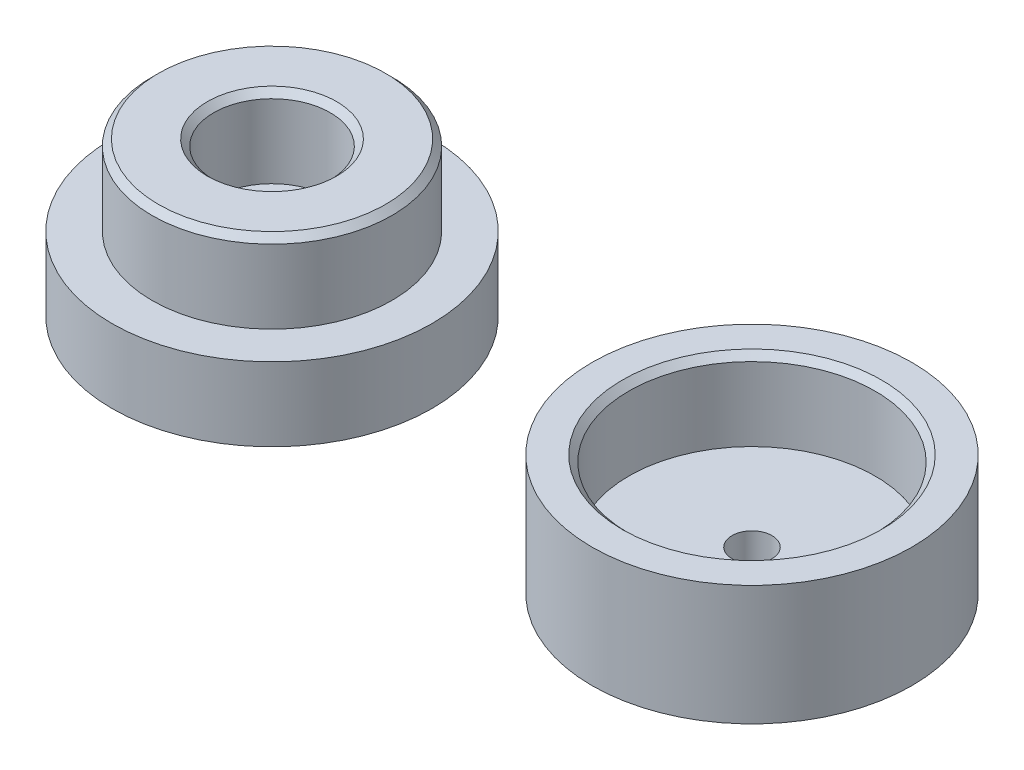
ISO-10303-21;
HEADER;
FILE_DESCRIPTION(('STEP AP214'),'2;1');
FILE_NAME('part.step','',(''),(''),'','','');
FILE_SCHEMA(('AUTOMOTIVE_DESIGN { 1 0 10303 214 1 1 1 1 }'));
ENDSEC;
DATA;
#1=APPLICATION_CONTEXT('core data for automotive mechanical design processes');
#2=APPLICATION_PROTOCOL_DEFINITION('international standard','automotive_design',2000,#1);
#3=PRODUCT_CONTEXT('',#1,'mechanical');
#4=PRODUCT('Part','Part','',(#3));
#5=PRODUCT_RELATED_PRODUCT_CATEGORY('part','',(#4));
#6=PRODUCT_DEFINITION_FORMATION('','',#4);
#7=PRODUCT_DEFINITION_CONTEXT('part definition',#1,'design');
#8=PRODUCT_DEFINITION('design','',#6,#7);
#9=PRODUCT_DEFINITION_SHAPE('','',#8);
#10=(LENGTH_UNIT() NAMED_UNIT(*) SI_UNIT(.MILLI.,.METRE.));
#11=(NAMED_UNIT(*) PLANE_ANGLE_UNIT() SI_UNIT($,.RADIAN.));
#12=(NAMED_UNIT(*) SI_UNIT($,.STERADIAN.) SOLID_ANGLE_UNIT());
#13=UNCERTAINTY_MEASURE_WITH_UNIT(LENGTH_MEASURE(1.E-05),#10,'distance_accuracy_value','');
#14=(GEOMETRIC_REPRESENTATION_CONTEXT(3) GLOBAL_UNCERTAINTY_ASSIGNED_CONTEXT((#13)) GLOBAL_UNIT_ASSIGNED_CONTEXT((#10,
#11,#12)) REPRESENTATION_CONTEXT('',''));
#15=CARTESIAN_POINT('',(0.,0.,0.));
#16=DIRECTION('',(0.,0.,1.));
#17=DIRECTION('',(1.,0.,0.));
#18=AXIS2_PLACEMENT_3D('',#15,#16,#17);
#19=CARTESIAN_POINT('',(0.,0.,0.));
#20=DIRECTION('',(0.,1.,0.));
#21=DIRECTION('',(0.,0.,1.));
#22=AXIS2_PLACEMENT_3D('',#19,#20,#21);
#23=PLANE('',#22);
#24=CARTESIAN_POINT('',(19.05,0.,0.));
#25=DIRECTION('',(0.,1.,0.));
#26=DIRECTION('',(0.,0.,1.));
#27=AXIS2_PLACEMENT_3D('',#24,#25,#26);
#28=CIRCLE('',#27,1.04774999999999);
#29=CARTESIAN_POINT('',(19.05,0.,1.04774999999999));
#30=VERTEX_POINT('',#29);
#31=EDGE_CURVE('E83',#30,#30,#28,.T.);
#32=ORIENTED_EDGE('',*,*,#31,.T.);
#33=EDGE_LOOP('',(#32));
#34=FACE_BOUND('',#33,.T.);
#35=CARTESIAN_POINT('',(19.05,0.,0.));
#36=DIRECTION('',(0.,1.,0.));
#37=DIRECTION('',(0.,0.,1.));
#38=AXIS2_PLACEMENT_3D('',#35,#36,#37);
#39=CIRCLE('',#38,6.35);
#40=CARTESIAN_POINT('',(19.05,0.,6.35));
#41=VERTEX_POINT('',#40);
#42=EDGE_CURVE('E95',#41,#41,#39,.T.);
#43=ORIENTED_EDGE('',*,*,#42,.F.);
#44=EDGE_LOOP('',(#43));
#45=FACE_BOUND('',#44,.T.);
#46=ADVANCED_FACE('F67',(#34,#45),#23,.F.);
#47=CARTESIAN_POINT('',(19.05,1.5875,0.));
#48=DIRECTION('',(0.,-1.,0.));
#49=DIRECTION('',(0.,0.,-1.));
#50=AXIS2_PLACEMENT_3D('',#47,#48,#49);
#51=CYLINDRICAL_SURFACE('',#50,6.35);
#52=ORIENTED_EDGE('',*,*,#42,.T.);
#53=EDGE_LOOP('',(#52));
#54=FACE_BOUND('',#53,.T.);
#55=CARTESIAN_POINT('',(19.05,4.7625,0.));
#56=DIRECTION('',(0.,1.,0.));
#57=DIRECTION('',(0.,0.,1.));
#58=AXIS2_PLACEMENT_3D('',#55,#56,#57);
#59=CIRCLE('',#58,6.35);
#60=CARTESIAN_POINT('',(19.05,4.7625,6.35));
#61=VERTEX_POINT('',#60);
#62=EDGE_CURVE('E92',#61,#61,#59,.T.);
#63=ORIENTED_EDGE('',*,*,#62,.F.);
#64=EDGE_LOOP('',(#63));
#65=FACE_BOUND('',#64,.T.);
#66=ADVANCED_FACE('F103',(#54,#65),#51,.T.);
#67=CARTESIAN_POINT('',(19.05,4.7625,0.));
#68=DIRECTION('',(0.,1.,0.));
#69=DIRECTION('',(0.,0.,1.));
#70=AXIS2_PLACEMENT_3D('',#67,#68,#69);
#71=PLANE('',#70);
#72=CARTESIAN_POINT('',(19.05,4.7625,0.));
#73=DIRECTION('',(0.,1.,0.));
#74=DIRECTION('',(0.,0.,1.));
#75=AXIS2_PLACEMENT_3D('',#72,#73,#74);
#76=CIRCLE('',#75,5.1435);
#77=CARTESIAN_POINT('',(19.05,4.7625,5.1435));
#78=VERTEX_POINT('',#77);
#79=EDGE_CURVE('E12',#78,#78,#76,.F.);
#80=ORIENTED_EDGE('',*,*,#79,.T.);
#81=EDGE_LOOP('',(#80));
#82=FACE_BOUND('',#81,.T.);
#83=ORIENTED_EDGE('',*,*,#62,.T.);
#84=EDGE_LOOP('',(#83));
#85=FACE_BOUND('',#84,.T.);
#86=ADVANCED_FACE('F101',(#82,#85),#71,.T.);
#87=CARTESIAN_POINT('',(19.05,4.7625,0.));
#88=DIRECTION('',(0.,-1.,0.));
#89=DIRECTION('',(0.,0.,-1.));
#90=AXIS2_PLACEMENT_3D('',#87,#88,#89);
#91=CYLINDRICAL_SURFACE('',#90,4.8895);
#92=CARTESIAN_POINT('',(19.05,4.5085,0.));
#93=DIRECTION('',(0.,1.,0.));
#94=DIRECTION('',(0.,0.,1.));
#95=AXIS2_PLACEMENT_3D('',#92,#93,#94);
#96=CIRCLE('',#95,4.8895);
#97=CARTESIAN_POINT('',(19.05,4.5085,4.8895));
#98=VERTEX_POINT('',#97);
#99=EDGE_CURVE('E75',#98,#98,#96,.T.);
#100=ORIENTED_EDGE('',*,*,#99,.T.);
#101=EDGE_LOOP('',(#100));
#102=FACE_BOUND('',#101,.T.);
#103=CARTESIAN_POINT('',(19.05,1.5875,0.));
#104=DIRECTION('',(0.,1.,0.));
#105=DIRECTION('',(0.,0.,1.));
#106=AXIS2_PLACEMENT_3D('',#103,#104,#105);
#107=CIRCLE('',#106,4.8895);
#108=CARTESIAN_POINT('',(19.05,1.5875,4.8895));
#109=VERTEX_POINT('',#108);
#110=EDGE_CURVE('E88',#109,#109,#107,.F.);
#111=ORIENTED_EDGE('',*,*,#110,.T.);
#112=EDGE_LOOP('',(#111));
#113=FACE_BOUND('',#112,.T.);
#114=ADVANCED_FACE('F111',(#102,#113),#91,.F.);
#115=CARTESIAN_POINT('',(0.,1.5875,0.));
#116=DIRECTION('',(0.,1.,0.));
#117=DIRECTION('',(0.,0.,1.));
#118=AXIS2_PLACEMENT_3D('',#115,#116,#117);
#119=PLANE('',#118);
#120=CARTESIAN_POINT('',(19.05,1.5875,0.));
#121=DIRECTION('',(0.,1.,0.));
#122=DIRECTION('',(0.,0.,1.));
#123=AXIS2_PLACEMENT_3D('',#120,#121,#122);
#124=CIRCLE('',#123,0.793749999999999);
#125=CARTESIAN_POINT('',(19.05,1.5875,0.793749999999999));
#126=VERTEX_POINT('',#125);
#127=EDGE_CURVE('E89',#126,#126,#124,.T.);
#128=ORIENTED_EDGE('',*,*,#127,.F.);
#129=EDGE_LOOP('',(#128));
#130=FACE_BOUND('',#129,.T.);
#131=ORIENTED_EDGE('',*,*,#110,.F.);
#132=EDGE_LOOP('',(#131));
#133=FACE_BOUND('',#132,.T.);
#134=ADVANCED_FACE('F129',(#130,#133),#119,.T.);
#135=CARTESIAN_POINT('',(19.05,-1.2E-05,0.));
#136=DIRECTION('',(0.,1.,0.));
#137=DIRECTION('',(0.,0.,1.));
#138=AXIS2_PLACEMENT_3D('',#135,#136,#137);
#139=CYLINDRICAL_SURFACE('',#138,0.793749999999999);
#140=CARTESIAN_POINT('',(19.05,0.253999999999996,0.));
#141=DIRECTION('',(0.,1.,0.));
#142=DIRECTION('',(0.,0.,1.));
#143=AXIS2_PLACEMENT_3D('',#140,#141,#142);
#144=CIRCLE('',#143,0.793749999999999);
#145=CARTESIAN_POINT('',(19.05,0.253999999999996,0.793749999999999));
#146=VERTEX_POINT('',#145);
#147=EDGE_CURVE('E79',#146,#146,#144,.F.);
#148=CARTESIAN_POINT('',(19.05,0.253999999999996,0.793749999999999));
#149=CARTESIAN_POINT('',(19.05,0.267890624999996,0.793749999999999));
#150=CARTESIAN_POINT('',(19.05,0.281781249999996,0.793749999999999));
#151=CARTESIAN_POINT('',(19.05,0.309562499999996,0.793749999999999));
#152=CARTESIAN_POINT('',(19.05,0.323453124999996,0.793749999999999));
#153=CARTESIAN_POINT('',(19.05,0.351234374999996,0.793749999999999));
#154=CARTESIAN_POINT('',(19.05,0.365124999999996,0.793749999999999));
#155=CARTESIAN_POINT('',(19.05,0.392906249999996,0.793749999999999));
#156=CARTESIAN_POINT('',(19.05,0.406796874999996,0.793749999999999));
#157=CARTESIAN_POINT('',(19.05,0.434578124999997,0.793749999999999));
#158=CARTESIAN_POINT('',(19.05,0.448468749999997,0.793749999999999));
#159=CARTESIAN_POINT('',(19.05,0.476249999999997,0.793749999999999));
#160=CARTESIAN_POINT('',(19.05,0.490140624999997,0.793749999999999));
#161=CARTESIAN_POINT('',(19.05,0.517921874999997,0.793749999999999));
#162=CARTESIAN_POINT('',(19.05,0.531812499999997,0.793749999999999));
#163=CARTESIAN_POINT('',(19.05,0.559593749999997,0.793749999999999));
#164=CARTESIAN_POINT('',(19.05,0.573484374999997,0.793749999999999));
#165=CARTESIAN_POINT('',(19.05,0.601265624999997,0.793749999999999));
#166=CARTESIAN_POINT('',(19.05,0.615156249999997,0.793749999999999));
#167=CARTESIAN_POINT('',(19.05,0.642937499999997,0.793749999999999));
#168=CARTESIAN_POINT('',(19.05,0.656828124999997,0.793749999999999));
#169=CARTESIAN_POINT('',(19.05,0.684609374999997,0.793749999999999));
#170=CARTESIAN_POINT('',(19.05,0.698499999999997,0.793749999999999));
#171=CARTESIAN_POINT('',(19.05,0.726281249999997,0.793749999999999));
#172=CARTESIAN_POINT('',(19.05,0.740171874999997,0.793749999999999));
#173=CARTESIAN_POINT('',(19.05,0.767953124999997,0.793749999999999));
#174=CARTESIAN_POINT('',(19.05,0.781843749999998,0.793749999999999));
#175=CARTESIAN_POINT('',(19.05,0.809624999999998,0.793749999999999));
#176=CARTESIAN_POINT('',(19.05,0.823515624999998,0.793749999999999));
#177=CARTESIAN_POINT('',(19.05,0.851296874999998,0.793749999999999));
#178=CARTESIAN_POINT('',(19.05,0.865187499999998,0.793749999999999));
#179=CARTESIAN_POINT('',(19.05,0.892968749999998,0.793749999999999));
#180=CARTESIAN_POINT('',(19.05,0.906859374999998,0.793749999999999));
#181=CARTESIAN_POINT('',(19.05,0.934640624999998,0.793749999999999));
#182=CARTESIAN_POINT('',(19.05,0.948531249999998,0.793749999999999));
#183=CARTESIAN_POINT('',(19.05,0.976312499999998,0.793749999999999));
#184=CARTESIAN_POINT('',(19.05,0.990203124999998,0.793749999999999));
#185=CARTESIAN_POINT('',(19.05,1.017984375,0.793749999999999));
#186=CARTESIAN_POINT('',(19.05,1.031875,0.793749999999999));
#187=CARTESIAN_POINT('',(19.05,1.05965625,0.793749999999999));
#188=CARTESIAN_POINT('',(19.05,1.073546875,0.793749999999999));
#189=CARTESIAN_POINT('',(19.05,1.101328125,0.793749999999999));
#190=CARTESIAN_POINT('',(19.05,1.11521875,0.793749999999999));
#191=CARTESIAN_POINT('',(19.05,1.143,0.793749999999999));
#192=CARTESIAN_POINT('',(19.05,1.156890625,0.793749999999999));
#193=CARTESIAN_POINT('',(19.05,1.184671875,0.793749999999999));
#194=CARTESIAN_POINT('',(19.05,1.1985625,0.793749999999999));
#195=CARTESIAN_POINT('',(19.05,1.22634375,0.793749999999999));
#196=CARTESIAN_POINT('',(19.05,1.240234375,0.793749999999999));
#197=CARTESIAN_POINT('',(19.05,1.268015625,0.793749999999999));
#198=CARTESIAN_POINT('',(19.05,1.28190625,0.793749999999999));
#199=CARTESIAN_POINT('',(19.05,1.3096875,0.793749999999999));
#200=CARTESIAN_POINT('',(19.05,1.323578125,0.793749999999999));
#201=CARTESIAN_POINT('',(19.05,1.351359375,0.793749999999999));
#202=CARTESIAN_POINT('',(19.05,1.36525,0.793749999999999));
#203=CARTESIAN_POINT('',(19.05,1.39303125,0.793749999999999));
#204=CARTESIAN_POINT('',(19.05,1.406921875,0.793749999999999));
#205=CARTESIAN_POINT('',(19.05,1.434703125,0.793749999999999));
#206=CARTESIAN_POINT('',(19.05,1.44859375,0.793749999999999));
#207=CARTESIAN_POINT('',(19.05,1.476375,0.793749999999999));
#208=CARTESIAN_POINT('',(19.05,1.490265625,0.793749999999999));
#209=CARTESIAN_POINT('',(19.05,1.518046875,0.793749999999999));
#210=CARTESIAN_POINT('',(19.05,1.5319375,0.793749999999999));
#211=CARTESIAN_POINT('',(19.05,1.55971875,0.793749999999999));
#212=CARTESIAN_POINT('',(19.05,1.573609375,0.793749999999999));
#213=CARTESIAN_POINT('',(19.05,1.5875,0.793749999999999));
#214=B_SPLINE_CURVE_WITH_KNOTS('',3,(#148,#149,#150,#151,#152,#153,#154,#155,#156,#157,#158,
#159,#160,#161,#162,#163,#164,#165,#166,#167,#168,#169,#170,#171,#172,#173,#174,#175,#176,#177,
#178,#179,#180,#181,#182,#183,#184,#185,#186,#187,#188,#189,#190,#191,#192,#193,#194,#195,#196,
#197,#198,#199,#200,#201,#202,#203,#204,#205,#206,#207,#208,#209,#210,#211,#212,#213),
.UNSPECIFIED.,.F.,.F.,(4,2,2,2,2,2,2,2,2,2,2,2,2,2,2,2,2,2,2,2,2,2,2,2,2,2,2,2,2,2,2,2,4),(0.,
0.0416718750000001,0.0833437500000002,0.125015625,0.1666875,0.208359375000001,0.250031250000001,
0.291703125000001,0.333375000000001,0.375046875000001,0.416718750000001,0.458390625000001,
0.500062500000002,0.541734375000002,0.583406250000002,0.625078125000002,0.666750000000002,
0.708421875000002,0.750093750000002,0.791765625000002,0.833437500000002,0.875109375000003,
0.916781250000003,0.958453125000003,1.000125,1.041796875,1.08346875,1.125140625,1.1668125,
1.208484375,1.25015625,1.291828125,1.3335),.UNSPECIFIED.);
#215=EDGE_CURVE('BSEAM122',#146,#126,#214,.T.);
#216=ORIENTED_EDGE('',*,*,#147,.T.);
#217=ORIENTED_EDGE('',*,*,#127,.T.);
#218=ORIENTED_EDGE('',*,*,#215,.T.);
#219=ORIENTED_EDGE('',*,*,#215,.F.);
#220=EDGE_LOOP('',(#216,#218,#217,#219));
#221=FACE_BOUND('',#220,.T.);
#222=ADVANCED_FACE('F122',(#221),#139,.F.);
#223=CARTESIAN_POINT('',(19.05,0.,0.));
#224=DIRECTION('',(0.,-1.,0.));
#225=DIRECTION('',(0.,0.,-1.));
#226=AXIS2_PLACEMENT_3D('',#223,#224,#225);
#227=CONICAL_SURFACE('',#226,1.04774999999999,0.785398163397447);
#228=ORIENTED_EDGE('',*,*,#147,.F.);
#229=EDGE_LOOP('',(#228));
#230=FACE_BOUND('',#229,.T.);
#231=ORIENTED_EDGE('',*,*,#31,.F.);
#232=EDGE_LOOP('',(#231));
#233=FACE_BOUND('',#232,.T.);
#234=ADVANCED_FACE('F118',(#230,#233),#227,.F.);
#235=CARTESIAN_POINT('',(19.05,4.5085,0.));
#236=DIRECTION('',(0.,1.,0.));
#237=DIRECTION('',(0.,0.,1.));
#238=AXIS2_PLACEMENT_3D('',#235,#236,#237);
#239=CONICAL_SURFACE('',#238,4.8895,0.78539816339745);
#240=ORIENTED_EDGE('',*,*,#79,.F.);
#241=EDGE_LOOP('',(#240));
#242=FACE_BOUND('',#241,.T.);
#243=ORIENTED_EDGE('',*,*,#99,.F.);
#244=EDGE_LOOP('',(#243));
#245=FACE_BOUND('',#244,.T.);
#246=ADVANCED_FACE('F70',(#242,#245),#239,.F.);
#247=CLOSED_SHELL('',(#46,#66,#86,#114,#134,#222,#234,#246));
#248=MANIFOLD_SOLID_BREP('B2',#247);
#249=CARTESIAN_POINT('',(0.,2.921,0.));
#250=DIRECTION('',(0.,1.,0.));
#251=DIRECTION('',(0.,0.,1.));
#252=AXIS2_PLACEMENT_3D('',#249,#250,#251);
#253=PLANE('',#252);
#254=CARTESIAN_POINT('',(0.,2.921,0.));
#255=DIRECTION('',(0.,1.,0.));
#256=DIRECTION('',(0.,0.,1.));
#257=AXIS2_PLACEMENT_3D('',#254,#255,#256);
#258=CIRCLE('',#257,0.79375);
#259=CARTESIAN_POINT('',(0.,2.921,0.79375));
#260=VERTEX_POINT('',#259);
#261=EDGE_CURVE('E243',#260,#260,#258,.T.);
#262=ORIENTED_EDGE('',*,*,#261,.F.);
#263=EDGE_LOOP('',(#262));
#264=FACE_BOUND('',#263,.T.);
#265=CARTESIAN_POINT('',(0.,2.921,0.));
#266=DIRECTION('',(0.,1.,0.));
#267=DIRECTION('',(0.,0.,1.));
#268=AXIS2_PLACEMENT_3D('',#265,#266,#267);
#269=CIRCLE('',#268,2.3114);
#270=CARTESIAN_POINT('',(0.,2.921,2.3114));
#271=VERTEX_POINT('',#270);
#272=EDGE_CURVE('E242',#271,#271,#269,.T.);
#273=ORIENTED_EDGE('',*,*,#272,.T.);
#274=EDGE_LOOP('',(#273));
#275=FACE_BOUND('',#274,.T.);
#276=ADVANCED_FACE('F213',(#264,#275),#253,.T.);
#277=CARTESIAN_POINT('',(0.,2.921,0.));
#278=DIRECTION('',(0.,-1.,0.));
#279=DIRECTION('',(0.,0.,-1.));
#280=AXIS2_PLACEMENT_3D('',#277,#278,#279);
#281=CYLINDRICAL_SURFACE('',#280,6.35);
#282=CARTESIAN_POINT('',(0.,2.921,0.));
#283=DIRECTION('',(0.,1.,0.));
#284=DIRECTION('',(0.,0.,1.));
#285=AXIS2_PLACEMENT_3D('',#282,#283,#284);
#286=CIRCLE('',#285,6.35);
#287=CARTESIAN_POINT('',(0.,2.921,6.35));
#288=VERTEX_POINT('',#287);
#289=EDGE_CURVE('E238',#288,#288,#286,.T.);
#290=ORIENTED_EDGE('',*,*,#289,.F.);
#291=EDGE_LOOP('',(#290));
#292=FACE_BOUND('',#291,.T.);
#293=CARTESIAN_POINT('',(0.,0.,0.));
#294=DIRECTION('',(0.,1.,0.));
#295=DIRECTION('',(0.,0.,1.));
#296=AXIS2_PLACEMENT_3D('',#293,#294,#295);
#297=CIRCLE('',#296,6.35);
#298=CARTESIAN_POINT('',(0.,0.,6.35));
#299=VERTEX_POINT('',#298);
#300=EDGE_CURVE('E239',#299,#299,#297,.T.);
#301=ORIENTED_EDGE('',*,*,#300,.T.);
#302=EDGE_LOOP('',(#301));
#303=FACE_BOUND('',#302,.T.);
#304=ADVANCED_FACE('F269',(#292,#303),#281,.T.);
#305=CARTESIAN_POINT('',(0.,2.921,0.));
#306=DIRECTION('',(0.,-1.,0.));
#307=DIRECTION('',(0.,0.,-1.));
#308=AXIS2_PLACEMENT_3D('',#305,#306,#307);
#309=CYLINDRICAL_SURFACE('',#308,0.79375);
#310=ORIENTED_EDGE('',*,*,#261,.T.);
#311=EDGE_LOOP('',(#310));
#312=FACE_BOUND('',#311,.T.);
#313=CARTESIAN_POINT('',(0.,0.,0.));
#314=DIRECTION('',(0.,1.,0.));
#315=DIRECTION('',(0.,0.,1.));
#316=AXIS2_PLACEMENT_3D('',#313,#314,#315);
#317=CIRCLE('',#316,0.79375);
#318=CARTESIAN_POINT('',(0.,0.,0.79375));
#319=VERTEX_POINT('',#318);
#320=EDGE_CURVE('E235',#319,#319,#317,.T.);
#321=ORIENTED_EDGE('',*,*,#320,.F.);
#322=EDGE_LOOP('',(#321));
#323=FACE_BOUND('',#322,.T.);
#324=ADVANCED_FACE('F278',(#312,#323),#309,.F.);
#325=CARTESIAN_POINT('',(0.,2.921,0.));
#326=DIRECTION('',(0.,1.,0.));
#327=DIRECTION('',(0.,0.,1.));
#328=AXIS2_PLACEMENT_3D('',#325,#326,#327);
#329=CIRCLE('',#328,4.7625);
#330=CARTESIAN_POINT('',(0.,2.921,4.7625));
#331=VERTEX_POINT('',#330);
#332=EDGE_CURVE('E234',#331,#331,#329,.T.);
#333=ORIENTED_EDGE('',*,*,#332,.F.);
#334=EDGE_LOOP('',(#333));
#335=FACE_BOUND('',#334,.T.);
#336=ORIENTED_EDGE('',*,*,#289,.T.);
#337=EDGE_LOOP('',(#336));
#338=FACE_BOUND('',#337,.T.);
#339=ADVANCED_FACE('F272',(#335,#338),#253,.T.);
#340=CARTESIAN_POINT('',(0.,0.,0.));
#341=DIRECTION('',(0.,1.,0.));
#342=DIRECTION('',(0.,0.,1.));
#343=AXIS2_PLACEMENT_3D('',#340,#341,#342);
#344=PLANE('',#343);
#345=ORIENTED_EDGE('',*,*,#300,.F.);
#346=EDGE_LOOP('',(#345));
#347=FACE_BOUND('',#346,.T.);
#348=ORIENTED_EDGE('',*,*,#320,.T.);
#349=EDGE_LOOP('',(#348));
#350=FACE_BOUND('',#349,.T.);
#351=ADVANCED_FACE('F283',(#347,#350),#344,.F.);
#352=CARTESIAN_POINT('',(0.,6.096,0.));
#353=DIRECTION('',(0.,1.,0.));
#354=DIRECTION('',(0.,0.,1.));
#355=AXIS2_PLACEMENT_3D('',#352,#353,#354);
#356=PLANE('',#355);
#357=CARTESIAN_POINT('',(0.,6.096,0.));
#358=DIRECTION('',(0.,1.,0.));
#359=DIRECTION('',(0.,0.,1.));
#360=AXIS2_PLACEMENT_3D('',#357,#358,#359);
#361=CIRCLE('',#360,2.56540000000001);
#362=CARTESIAN_POINT('',(0.,6.096,2.56540000000001));
#363=VERTEX_POINT('',#362);
#364=EDGE_CURVE('E221',#363,#363,#361,.F.);
#365=ORIENTED_EDGE('',*,*,#364,.T.);
#366=EDGE_LOOP('',(#365));
#367=FACE_BOUND('',#366,.T.);
#368=CARTESIAN_POINT('',(0.,6.096,0.));
#369=DIRECTION('',(0.,1.,0.));
#370=DIRECTION('',(0.,0.,1.));
#371=AXIS2_PLACEMENT_3D('',#368,#369,#370);
#372=CIRCLE('',#371,4.50850000000001);
#373=CARTESIAN_POINT('',(0.,6.096,4.50850000000001));
#374=VERTEX_POINT('',#373);
#375=EDGE_CURVE('E225',#374,#374,#372,.T.);
#376=ORIENTED_EDGE('',*,*,#375,.T.);
#377=EDGE_LOOP('',(#376));
#378=FACE_BOUND('',#377,.T.);
#379=ADVANCED_FACE('F265',(#367,#378),#356,.T.);
#380=CARTESIAN_POINT('',(0.,6.096,0.));
#381=DIRECTION('',(0.,-1.,0.));
#382=DIRECTION('',(0.,0.,-1.));
#383=AXIS2_PLACEMENT_3D('',#380,#381,#382);
#384=CYLINDRICAL_SURFACE('',#383,4.7625);
#385=CARTESIAN_POINT('',(0.,5.842,0.));
#386=DIRECTION('',(0.,1.,0.));
#387=DIRECTION('',(0.,0.,1.));
#388=AXIS2_PLACEMENT_3D('',#385,#386,#387);
#389=CIRCLE('',#388,4.7625);
#390=CARTESIAN_POINT('',(0.,5.842,4.7625));
#391=VERTEX_POINT('',#390);
#392=EDGE_CURVE('E66',#391,#391,#389,.F.);
#393=ORIENTED_EDGE('',*,*,#392,.T.);
#394=EDGE_LOOP('',(#393));
#395=FACE_BOUND('',#394,.T.);
#396=ORIENTED_EDGE('',*,*,#332,.T.);
#397=EDGE_LOOP('',(#396));
#398=FACE_BOUND('',#397,.T.);
#399=ADVANCED_FACE('F257',(#395,#398),#384,.T.);
#400=CARTESIAN_POINT('',(0.,6.096,0.));
#401=DIRECTION('',(0.,-1.,0.));
#402=DIRECTION('',(0.,0.,-1.));
#403=AXIS2_PLACEMENT_3D('',#400,#401,#402);
#404=CYLINDRICAL_SURFACE('',#403,2.3114);
#405=CARTESIAN_POINT('',(0.,5.84199999999999,0.));
#406=DIRECTION('',(0.,1.,0.));
#407=DIRECTION('',(0.,0.,1.));
#408=AXIS2_PLACEMENT_3D('',#405,#406,#407);
#409=CIRCLE('',#408,2.3114);
#410=CARTESIAN_POINT('',(0.,5.84199999999999,2.3114));
#411=VERTEX_POINT('',#410);
#412=EDGE_CURVE('E229',#411,#411,#409,.T.);
#413=ORIENTED_EDGE('',*,*,#412,.T.);
#414=EDGE_LOOP('',(#413));
#415=FACE_BOUND('',#414,.T.);
#416=ORIENTED_EDGE('',*,*,#272,.F.);
#417=EDGE_LOOP('',(#416));
#418=FACE_BOUND('',#417,.T.);
#419=ADVANCED_FACE('F254',(#415,#418),#404,.F.);
#420=CARTESIAN_POINT('',(0.,5.84199999999999,0.));
#421=DIRECTION('',(0.,1.,0.));
#422=DIRECTION('',(0.,0.,1.));
#423=AXIS2_PLACEMENT_3D('',#420,#421,#422);
#424=CONICAL_SURFACE('',#423,2.3114,0.785398163397451);
#425=ORIENTED_EDGE('',*,*,#364,.F.);
#426=EDGE_LOOP('',(#425));
#427=FACE_BOUND('',#426,.T.);
#428=ORIENTED_EDGE('',*,*,#412,.F.);
#429=EDGE_LOOP('',(#428));
#430=FACE_BOUND('',#429,.T.);
#431=ADVANCED_FACE('F256',(#427,#430),#424,.F.);
#432=CARTESIAN_POINT('',(0.,6.096,0.));
#433=DIRECTION('',(0.,-1.,0.));
#434=DIRECTION('',(0.,0.,-1.));
#435=AXIS2_PLACEMENT_3D('',#432,#433,#434);
#436=CONICAL_SURFACE('',#435,4.50850000000001,0.785398163397447);
#437=ORIENTED_EDGE('',*,*,#392,.F.);
#438=EDGE_LOOP('',(#437));
#439=FACE_BOUND('',#438,.T.);
#440=ORIENTED_EDGE('',*,*,#375,.F.);
#441=EDGE_LOOP('',(#440));
#442=FACE_BOUND('',#441,.T.);
#443=ADVANCED_FACE('F216',(#439,#442),#436,.T.);
#444=CLOSED_SHELL('',(#276,#304,#324,#339,#351,#379,#399,#419,#431,#443));
#445=MANIFOLD_SOLID_BREP('B7',#444);
#446=ADVANCED_BREP_SHAPE_REPRESENTATION('',(#18,#248,#445),#14);
#447=SHAPE_DEFINITION_REPRESENTATION(#9,#446);
ENDSEC;
END-ISO-10303-21;
